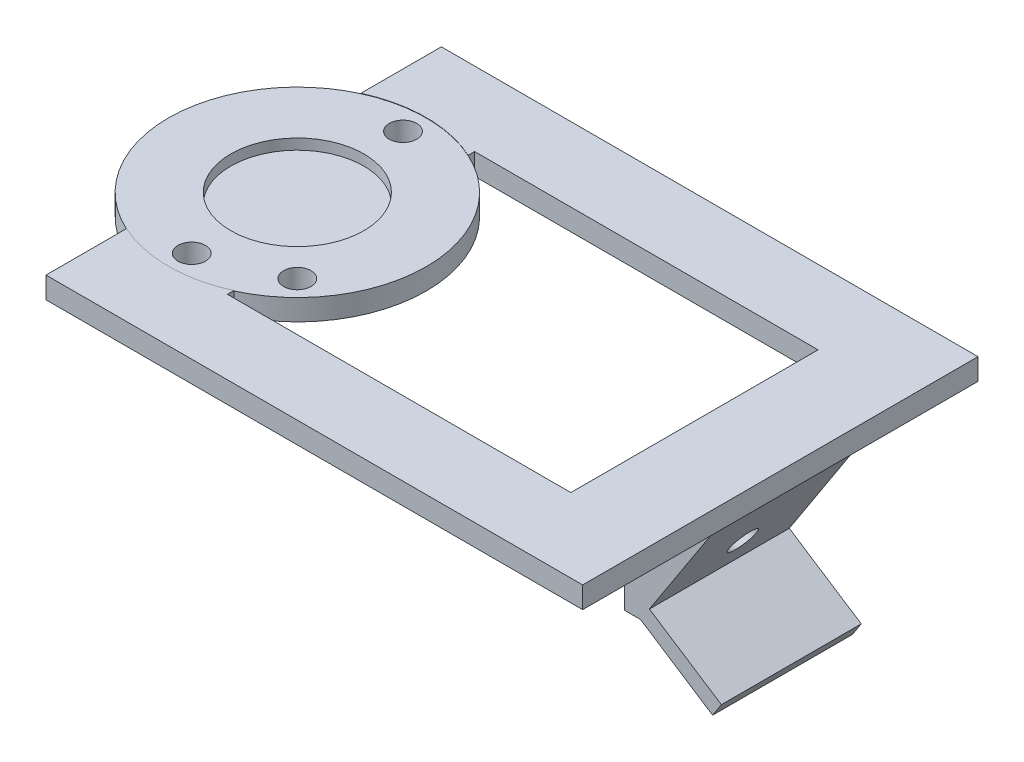
ISO-10303-21;
HEADER;
FILE_DESCRIPTION(('STEP AP214'),'2;1');
FILE_NAME('part.step','',(''),(''),'','','');
FILE_SCHEMA(('AUTOMOTIVE_DESIGN { 1 0 10303 214 1 1 1 1 }'));
ENDSEC;
DATA;
#1=APPLICATION_CONTEXT('core data for automotive mechanical design processes');
#2=APPLICATION_PROTOCOL_DEFINITION('international standard','automotive_design',2000,#1);
#3=PRODUCT_CONTEXT('',#1,'mechanical');
#4=PRODUCT('Part','Part','',(#3));
#5=PRODUCT_RELATED_PRODUCT_CATEGORY('part','',(#4));
#6=PRODUCT_DEFINITION_FORMATION('','',#4);
#7=PRODUCT_DEFINITION_CONTEXT('part definition',#1,'design');
#8=PRODUCT_DEFINITION('design','',#6,#7);
#9=PRODUCT_DEFINITION_SHAPE('','',#8);
#10=(LENGTH_UNIT() NAMED_UNIT(*) SI_UNIT(.MILLI.,.METRE.));
#11=(NAMED_UNIT(*) PLANE_ANGLE_UNIT() SI_UNIT($,.RADIAN.));
#12=(NAMED_UNIT(*) SI_UNIT($,.STERADIAN.) SOLID_ANGLE_UNIT());
#13=UNCERTAINTY_MEASURE_WITH_UNIT(LENGTH_MEASURE(1.E-05),#10,'distance_accuracy_value','');
#14=(GEOMETRIC_REPRESENTATION_CONTEXT(3) GLOBAL_UNCERTAINTY_ASSIGNED_CONTEXT((#13)) GLOBAL_UNIT_ASSIGNED_CONTEXT((#10,
#11,#12)) REPRESENTATION_CONTEXT('',''));
#15=CARTESIAN_POINT('',(0.,0.,0.));
#16=DIRECTION('',(0.,0.,1.));
#17=DIRECTION('',(1.,0.,0.));
#18=AXIS2_PLACEMENT_3D('',#15,#16,#17);
#19=CARTESIAN_POINT('',(99.0145469016071,-9.53413144874305,0.));
#20=DIRECTION('',(0.838443616300637,-0.544988350595414,0.));
#21=DIRECTION('',(0.544988350595414,0.838443616300637,0.));
#22=AXIS2_PLACEMENT_3D('',#19,#20,#21);
#23=CYLINDRICAL_SURFACE('',#22,3.302);
#24=CARTESIAN_POINT('',(105.403487257818,-13.6869426802801,0.));
#25=DIRECTION('',(0.838443616300637,-0.544988350595414,0.));
#26=DIRECTION('',(0.544988350595414,0.838443616300637,0.));
#27=AXIS2_PLACEMENT_3D('',#24,#25,#26);
#28=CIRCLE('',#27,3.302);
#29=CARTESIAN_POINT('',(107.203038791484,-10.9184018592554,0.));
#30=VERTEX_POINT('',#29);
#31=EDGE_CURVE('E684',#30,#30,#28,.T.);
#32=ORIENTED_EDGE('',*,*,#31,.T.);
#33=EDGE_LOOP('',(#32));
#34=FACE_BOUND('',#33,.T.);
#35=CARTESIAN_POINT('',(101.730392816078,-11.2994312931489,0.));
#36=DIRECTION('',(-0.813733471206735,0.581238193719096,0.));
#37=DIRECTION('',(0.581238193719096,0.813733471206735,0.));
#38=AXIS2_PLACEMENT_3D('',#35,#36,#37);
#39=ELLIPSE('',#38,3.30518064540003,3.302);
#40=CARTESIAN_POINT('',(103.651490044325,-8.60989517360224,0.));
#41=VERTEX_POINT('',#40);
#42=EDGE_CURVE('E39',#41,#41,#39,.F.);
#43=ORIENTED_EDGE('',*,*,#42,.F.);
#44=EDGE_LOOP('',(#43));
#45=FACE_BOUND('',#44,.T.);
#46=ADVANCED_FACE('F35',(#34,#45),#23,.F.);
#47=CARTESIAN_POINT('',(97.79,-25.4,-16.7198719801008));
#48=DIRECTION('',(-0.838443616300637,0.544988350595414,0.));
#49=DIRECTION('',(-0.544988350595414,-0.838443616300637,0.));
#50=AXIS2_PLACEMENT_3D('',#47,#48,#49);
#51=PLANE('',#50);
#52=ORIENTED_EDGE('',*,*,#31,.F.);
#53=EDGE_LOOP('',(#52));
#54=FACE_BOUND('',#53,.T.);
#55=DIRECTION('',(0.,0.,1.));
#56=VECTOR('',#55,1.);
#57=CARTESIAN_POINT('',(99.8664056157685,-22.2055298218946,-16.5541280198992));
#58=LINE('',#57,#56);
#59=CARTESIAN_POINT('',(99.8664056157685,-22.2055298218946,-16.5541280198992));
#60=VERTEX_POINT('',#59);
#61=CARTESIAN_POINT('',(99.8664056157685,-22.2055298218946,16.5541280198992));
#62=VERTEX_POINT('',#61);
#63=EDGE_CURVE('E204',#60,#62,#58,.T.);
#64=ORIENTED_EDGE('',*,*,#63,.F.);
#65=DIRECTION('',(-0.544988350595414,-0.838443616300637,0.));
#66=VECTOR('',#65,1.);
#67=CARTESIAN_POINT('',(96.6583831282953,-27.1409490333919,-16.5541280198992));
#68=LINE('',#67,#66);
#69=CARTESIAN_POINT('',(114.3,0.,-16.5541280198992));
#70=VERTEX_POINT('',#69);
#71=EDGE_CURVE('E210',#70,#60,#68,.T.);
#72=ORIENTED_EDGE('',*,*,#71,.F.);
#73=DIRECTION('',(0.,0.,1.));
#74=VECTOR('',#73,1.);
#75=CARTESIAN_POINT('',(114.3,0.,-16.7198719801008));
#76=LINE('',#75,#74);
#77=CARTESIAN_POINT('',(114.3,0.,16.5541280198992));
#78=VERTEX_POINT('',#77);
#79=EDGE_CURVE('E226',#70,#78,#76,.T.);
#80=ORIENTED_EDGE('',*,*,#79,.T.);
#81=DIRECTION('',(-0.544988350595414,-0.838443616300637,0.));
#82=VECTOR('',#81,1.);
#83=CARTESIAN_POINT('',(97.79,-25.4,16.5541280198992));
#84=LINE('',#83,#82);
#85=EDGE_CURVE('E223',#78,#62,#84,.T.);
#86=ORIENTED_EDGE('',*,*,#85,.T.);
#87=EDGE_LOOP('',(#64,#72,#80,#86));
#88=FACE_BOUND('',#87,.T.);
#89=ADVANCED_FACE('F469',(#54,#88),#51,.F.);
#90=CARTESIAN_POINT('',(93.98,0.,-34.2458719801008));
#91=DIRECTION('',(1.,0.,0.));
#92=DIRECTION('',(0.,0.,-1.));
#93=AXIS2_PLACEMENT_3D('',#90,#91,#92);
#94=PLANE('',#93);
#95=DIRECTION('',(0.,0.,1.));
#96=VECTOR('',#95,1.);
#97=CARTESIAN_POINT('',(93.98,0.,-34.2458719801008));
#98=LINE('',#97,#96);
#99=CARTESIAN_POINT('',(93.98,0.,-29.2541280198992));
#100=VERTEX_POINT('',#99);
#101=CARTESIAN_POINT('',(93.98,0.,29.2541280198992));
#102=VERTEX_POINT('',#101);
#103=EDGE_CURVE('E252',#100,#102,#98,.T.);
#104=ORIENTED_EDGE('',*,*,#103,.T.);
#105=DIRECTION('',(0.,1.,0.));
#106=VECTOR('',#105,1.);
#107=CARTESIAN_POINT('',(93.98,0.,29.2541280198992));
#108=LINE('',#107,#106);
#109=CARTESIAN_POINT('',(93.98,5.08,29.2541280198992));
#110=VERTEX_POINT('',#109);
#111=EDGE_CURVE('E247',#102,#110,#108,.T.);
#112=ORIENTED_EDGE('',*,*,#111,.T.);
#113=DIRECTION('',(0.,0.,1.));
#114=VECTOR('',#113,1.);
#115=CARTESIAN_POINT('',(93.98,5.08,-34.2458719801008));
#116=LINE('',#115,#114);
#117=CARTESIAN_POINT('',(93.98,5.08,-29.2541280198992));
#118=VERTEX_POINT('',#117);
#119=EDGE_CURVE('E250',#118,#110,#116,.T.);
#120=ORIENTED_EDGE('',*,*,#119,.F.);
#121=DIRECTION('',(0.,-1.,0.));
#122=VECTOR('',#121,1.);
#123=CARTESIAN_POINT('',(93.98,0.,-29.2541280198992));
#124=LINE('',#123,#122);
#125=EDGE_CURVE('E254',#118,#100,#124,.T.);
#126=ORIENTED_EDGE('',*,*,#125,.T.);
#127=EDGE_LOOP('',(#104,#112,#120,#126));
#128=FACE_BOUND('',#127,.T.);
#129=ADVANCED_FACE('F453',(#128),#94,.F.);
#130=CARTESIAN_POINT('',(0.,0.,0.));
#131=DIRECTION('',(0.,1.,0.));
#132=DIRECTION('',(0.,0.,1.));
#133=AXIS2_PLACEMENT_3D('',#130,#131,#132);
#134=PLANE('',#133);
#135=DIRECTION('',(1.,0.,0.));
#136=VECTOR('',#135,1.);
#137=CARTESIAN_POINT('',(93.98,0.,-16.5541280198992));
#138=LINE('',#137,#136);
#139=CARTESIAN_POINT('',(106.68,0.,-16.5541280198992));
#140=VERTEX_POINT('',#139);
#141=EDGE_CURVE('E229',#140,#70,#138,.T.);
#142=ORIENTED_EDGE('',*,*,#141,.F.);
#143=DIRECTION('',(0.,0.,1.));
#144=VECTOR('',#143,1.);
#145=CARTESIAN_POINT('',(106.68,0.,-16.7198719801008));
#146=LINE('',#145,#144);
#147=CARTESIAN_POINT('',(106.68,0.,16.5541280198992));
#148=VERTEX_POINT('',#147);
#149=EDGE_CURVE('E217',#140,#148,#146,.T.);
#150=ORIENTED_EDGE('',*,*,#149,.T.);
#151=DIRECTION('',(-1.,0.,0.));
#152=VECTOR('',#151,1.);
#153=CARTESIAN_POINT('',(93.98,0.,16.5541280198992));
#154=LINE('',#153,#152);
#155=EDGE_CURVE('E234',#78,#148,#154,.T.);
#156=ORIENTED_EDGE('',*,*,#155,.F.);
#157=DIRECTION('',(0.,0.,-1.));
#158=VECTOR('',#157,1.);
#159=CARTESIAN_POINT('',(114.3,0.,-46.7801280198992));
#160=LINE('',#159,#158);
#161=CARTESIAN_POINT('',(114.3,0.,46.7801280198992));
#162=VERTEX_POINT('',#161);
#163=EDGE_CURVE('E274',#162,#78,#160,.T.);
#164=ORIENTED_EDGE('',*,*,#163,.F.);
#165=DIRECTION('',(-1.,0.,0.));
#166=VECTOR('',#165,1.);
#167=CARTESIAN_POINT('',(0.,0.,46.7801280198992));
#168=LINE('',#167,#166);
#169=CARTESIAN_POINT('',(-12.7,0.,46.7801280198992));
#170=VERTEX_POINT('',#169);
#171=EDGE_CURVE('E319',#162,#170,#168,.T.);
#172=ORIENTED_EDGE('',*,*,#171,.T.);
#173=DIRECTION('',(0.,0.,1.));
#174=VECTOR('',#173,1.);
#175=CARTESIAN_POINT('',(-12.7,0.,0.));
#176=LINE('',#175,#174);
#177=CARTESIAN_POINT('',(-12.7,0.,27.7301280198992));
#178=VERTEX_POINT('',#177);
#179=EDGE_CURVE('E315',#178,#170,#176,.T.);
#180=ORIENTED_EDGE('',*,*,#179,.F.);
#181=CARTESIAN_POINT('',(0.,0.,0.));
#182=DIRECTION('',(0.,1.,0.));
#183=DIRECTION('',(0.,0.,1.));
#184=AXIS2_PLACEMENT_3D('',#181,#182,#183);
#185=CIRCLE('',#184,30.5);
#186=CARTESIAN_POINT('',(-12.7,0.,-27.7301280198992));
#187=VERTEX_POINT('',#186);
#188=EDGE_CURVE('E374',#187,#178,#185,.T.);
#189=ORIENTED_EDGE('',*,*,#188,.F.);
#190=DIRECTION('',(0.,0.,-1.));
#191=VECTOR('',#190,1.);
#192=CARTESIAN_POINT('',(-12.7,0.,0.));
#193=LINE('',#192,#191);
#194=CARTESIAN_POINT('',(-12.7,0.,-46.7801280198992));
#195=VERTEX_POINT('',#194);
#196=EDGE_CURVE('E298',#187,#195,#193,.T.);
#197=ORIENTED_EDGE('',*,*,#196,.T.);
#198=DIRECTION('',(1.,0.,0.));
#199=VECTOR('',#198,1.);
#200=CARTESIAN_POINT('',(0.,0.,-46.7801280198992));
#201=LINE('',#200,#199);
#202=CARTESIAN_POINT('',(114.3,0.,-46.7801280198992));
#203=VERTEX_POINT('',#202);
#204=EDGE_CURVE('E288',#195,#203,#201,.T.);
#205=ORIENTED_EDGE('',*,*,#204,.T.);
#206=EDGE_CURVE('E273',#70,#203,#160,.T.);
#207=ORIENTED_EDGE('',*,*,#206,.F.);
#208=EDGE_LOOP('',(#142,#150,#156,#164,#172,#180,#189,#197,#205,#207));
#209=FACE_BOUND('',#208,.T.);
#210=CARTESIAN_POINT('',(17.6744764826842,0.,17.680862));
#211=DIRECTION('',(0.,-1.,0.));
#212=DIRECTION('',(0.,0.,-1.));
#213=AXIS2_PLACEMENT_3D('',#210,#211,#212);
#214=CIRCLE('',#213,3.25);
#215=CARTESIAN_POINT('',(17.6744764826842,0.,14.430862));
#216=VERTEX_POINT('',#215);
#217=EDGE_CURVE('E346',#216,#216,#214,.T.);
#218=ORIENTED_EDGE('',*,*,#217,.F.);
#219=EDGE_LOOP('',(#218));
#220=FACE_BOUND('',#219,.T.);
#221=CARTESIAN_POINT('',(0.,0.,25.));
#222=DIRECTION('',(0.,-1.,0.));
#223=DIRECTION('',(0.,0.,-1.));
#224=AXIS2_PLACEMENT_3D('',#221,#222,#223);
#225=CIRCLE('',#224,3.25);
#226=CARTESIAN_POINT('',(0.,0.,21.75));
#227=VERTEX_POINT('',#226);
#228=EDGE_CURVE('E352',#227,#227,#225,.T.);
#229=ORIENTED_EDGE('',*,*,#228,.F.);
#230=EDGE_LOOP('',(#229));
#231=FACE_BOUND('',#230,.T.);
#232=CARTESIAN_POINT('',(0.,0.,-25.));
#233=DIRECTION('',(0.,-1.,0.));
#234=DIRECTION('',(0.,0.,-1.));
#235=AXIS2_PLACEMENT_3D('',#232,#233,#234);
#236=CIRCLE('',#235,3.25);
#237=CARTESIAN_POINT('',(0.,0.,-28.25));
#238=VERTEX_POINT('',#237);
#239=EDGE_CURVE('E358',#238,#238,#236,.T.);
#240=ORIENTED_EDGE('',*,*,#239,.F.);
#241=EDGE_LOOP('',(#240));
#242=FACE_BOUND('',#241,.T.);
#243=CARTESIAN_POINT('',(0.,0.,0.));
#244=DIRECTION('',(0.,-1.,0.));
#245=DIRECTION('',(0.,0.,-1.));
#246=AXIS2_PLACEMENT_3D('',#243,#244,#245);
#247=CIRCLE('',#246,15.75);
#248=CARTESIAN_POINT('',(0.,0.,-15.75));
#249=VERTEX_POINT('',#248);
#250=EDGE_CURVE('E44',#249,#249,#247,.T.);
#251=ORIENTED_EDGE('',*,*,#250,.F.);
#252=EDGE_LOOP('',(#251));
#253=FACE_BOUND('',#252,.T.);
#254=DIRECTION('',(-1.,0.,0.));
#255=VECTOR('',#254,1.);
#256=CARTESIAN_POINT('',(114.3,0.,29.2541280198992));
#257=LINE('',#256,#255);
#258=CARTESIAN_POINT('',(12.7,0.,29.2541280198992));
#259=VERTEX_POINT('',#258);
#260=EDGE_CURVE('E265',#102,#259,#257,.T.);
#261=ORIENTED_EDGE('',*,*,#260,.F.);
#262=ORIENTED_EDGE('',*,*,#103,.F.);
#263=DIRECTION('',(-1.,0.,0.));
#264=VECTOR('',#263,1.);
#265=CARTESIAN_POINT('',(114.3,0.,-29.2541280198992));
#266=LINE('',#265,#264);
#267=CARTESIAN_POINT('',(12.7,0.,-29.2541280198992));
#268=VERTEX_POINT('',#267);
#269=EDGE_CURVE('E277',#100,#268,#266,.T.);
#270=ORIENTED_EDGE('',*,*,#269,.T.);
#271=DIRECTION('',(0.,0.,-1.));
#272=VECTOR('',#271,1.);
#273=CARTESIAN_POINT('',(12.7,0.,0.));
#274=LINE('',#273,#272);
#275=CARTESIAN_POINT('',(12.7,0.,-27.7301280198992));
#276=VERTEX_POINT('',#275);
#277=EDGE_CURVE('E283',#276,#268,#274,.T.);
#278=ORIENTED_EDGE('',*,*,#277,.F.);
#279=CARTESIAN_POINT('',(12.7,0.,27.7301280198992));
#280=VERTEX_POINT('',#279);
#281=EDGE_CURVE('E380',#280,#276,#185,.T.);
#282=ORIENTED_EDGE('',*,*,#281,.F.);
#283=DIRECTION('',(0.,0.,1.));
#284=VECTOR('',#283,1.);
#285=CARTESIAN_POINT('',(12.7,0.,0.));
#286=LINE('',#285,#284);
#287=EDGE_CURVE('E330',#280,#259,#286,.T.);
#288=ORIENTED_EDGE('',*,*,#287,.T.);
#289=EDGE_LOOP('',(#261,#262,#270,#278,#282,#288));
#290=FACE_BOUND('',#289,.T.);
#291=ADVANCED_FACE('F399',(#209,#220,#231,#242,#253,#290),#134,.F.);
#292=CARTESIAN_POINT('',(114.3,0.,-29.2541280198992));
#293=DIRECTION('',(0.,0.,-1.));
#294=DIRECTION('',(-1.,0.,0.));
#295=AXIS2_PLACEMENT_3D('',#292,#293,#294);
#296=PLANE('',#295);
#297=ORIENTED_EDGE('',*,*,#125,.F.);
#298=DIRECTION('',(-1.,0.,0.));
#299=VECTOR('',#298,1.);
#300=CARTESIAN_POINT('',(114.3,5.08,-29.2541280198992));
#301=LINE('',#300,#299);
#302=CARTESIAN_POINT('',(12.7,5.08,-29.2541280198992));
#303=VERTEX_POINT('',#302);
#304=EDGE_CURVE('E281',#118,#303,#301,.T.);
#305=ORIENTED_EDGE('',*,*,#304,.T.);
#306=DIRECTION('',(0.,-1.,0.));
#307=VECTOR('',#306,1.);
#308=CARTESIAN_POINT('',(12.7,0.,-29.2541280198992));
#309=LINE('',#308,#307);
#310=EDGE_CURVE('E267',#303,#268,#309,.T.);
#311=ORIENTED_EDGE('',*,*,#310,.T.);
#312=ORIENTED_EDGE('',*,*,#269,.F.);
#313=EDGE_LOOP('',(#297,#305,#311,#312));
#314=FACE_BOUND('',#313,.T.);
#315=ADVANCED_FACE('F451',(#314),#296,.F.);
#316=CARTESIAN_POINT('',(114.3,0.,29.2541280198992));
#317=DIRECTION('',(0.,0.,1.));
#318=DIRECTION('',(1.,0.,0.));
#319=AXIS2_PLACEMENT_3D('',#316,#317,#318);
#320=PLANE('',#319);
#321=ORIENTED_EDGE('',*,*,#111,.F.);
#322=ORIENTED_EDGE('',*,*,#260,.T.);
#323=DIRECTION('',(0.,1.,0.));
#324=VECTOR('',#323,1.);
#325=CARTESIAN_POINT('',(12.7,0.,29.2541280198992));
#326=LINE('',#325,#324);
#327=CARTESIAN_POINT('',(12.7,5.08,29.2541280198992));
#328=VERTEX_POINT('',#327);
#329=EDGE_CURVE('E257',#259,#328,#326,.T.);
#330=ORIENTED_EDGE('',*,*,#329,.T.);
#331=DIRECTION('',(-1.,0.,0.));
#332=VECTOR('',#331,1.);
#333=CARTESIAN_POINT('',(114.3,5.08,29.2541280198992));
#334=LINE('',#333,#332);
#335=EDGE_CURVE('E261',#110,#328,#334,.T.);
#336=ORIENTED_EDGE('',*,*,#335,.F.);
#337=EDGE_LOOP('',(#321,#322,#330,#336));
#338=FACE_BOUND('',#337,.T.);
#339=ADVANCED_FACE('F457',(#338),#320,.F.);
#340=CARTESIAN_POINT('',(12.7,5.08,0.));
#341=DIRECTION('',(1.,0.,0.));
#342=DIRECTION('',(0.,0.,-1.));
#343=AXIS2_PLACEMENT_3D('',#340,#341,#342);
#344=PLANE('',#343);
#345=DIRECTION('',(0.,0.,1.));
#346=VECTOR('',#345,1.);
#347=CARTESIAN_POINT('',(12.7,5.08,0.));
#348=LINE('',#347,#346);
#349=CARTESIAN_POINT('',(12.7,5.08,27.7301280198992));
#350=VERTEX_POINT('',#349);
#351=EDGE_CURVE('E321',#350,#328,#348,.T.);
#352=ORIENTED_EDGE('',*,*,#351,.T.);
#353=ORIENTED_EDGE('',*,*,#329,.F.);
#354=ORIENTED_EDGE('',*,*,#287,.F.);
#355=DIRECTION('',(0.,-1.,0.));
#356=VECTOR('',#355,1.);
#357=CARTESIAN_POINT('',(12.7,5.08,27.7301280198992));
#358=LINE('',#357,#356);
#359=CARTESIAN_POINT('',(12.7,5.,27.7301280198992));
#360=VERTEX_POINT('',#359);
#361=EDGE_CURVE('E341',#360,#280,#358,.T.);
#362=ORIENTED_EDGE('',*,*,#361,.F.);
#363=EDGE_CURVE('E338',#350,#360,#358,.T.);
#364=ORIENTED_EDGE('',*,*,#363,.F.);
#365=EDGE_LOOP('',(#352,#353,#354,#362,#364));
#366=FACE_BOUND('',#365,.T.);
#367=ADVANCED_FACE('F427',(#366),#344,.T.);
#368=CARTESIAN_POINT('',(12.7,5.08,0.));
#369=DIRECTION('',(-1.,0.,0.));
#370=DIRECTION('',(0.,0.,1.));
#371=AXIS2_PLACEMENT_3D('',#368,#369,#370);
#372=PLANE('',#371);
#373=ORIENTED_EDGE('',*,*,#310,.F.);
#374=DIRECTION('',(0.,0.,-1.));
#375=VECTOR('',#374,1.);
#376=CARTESIAN_POINT('',(12.7,5.08,0.));
#377=LINE('',#376,#375);
#378=CARTESIAN_POINT('',(12.7,5.08,-27.7301280198992));
#379=VERTEX_POINT('',#378);
#380=EDGE_CURVE('E284',#379,#303,#377,.T.);
#381=ORIENTED_EDGE('',*,*,#380,.F.);
#382=DIRECTION('',(0.,-1.,0.));
#383=VECTOR('',#382,1.);
#384=CARTESIAN_POINT('',(12.7,5.08,-27.7301280198992));
#385=LINE('',#384,#383);
#386=CARTESIAN_POINT('',(12.7,5.,-27.7301280198992));
#387=VERTEX_POINT('',#386);
#388=EDGE_CURVE('E310',#379,#387,#385,.T.);
#389=ORIENTED_EDGE('',*,*,#388,.T.);
#390=EDGE_CURVE('E295',#387,#276,#385,.T.);
#391=ORIENTED_EDGE('',*,*,#390,.T.);
#392=ORIENTED_EDGE('',*,*,#277,.T.);
#393=EDGE_LOOP('',(#373,#381,#389,#391,#392));
#394=FACE_BOUND('',#393,.T.);
#395=ADVANCED_FACE('F435',(#394),#372,.F.);
#396=CARTESIAN_POINT('',(0.,5.,0.));
#397=DIRECTION('',(0.,-1.,0.));
#398=DIRECTION('',(0.,0.,-1.));
#399=AXIS2_PLACEMENT_3D('',#396,#397,#398);
#400=CYLINDRICAL_SURFACE('',#399,30.5);
#401=ORIENTED_EDGE('',*,*,#390,.F.);
#402=CARTESIAN_POINT('',(0.,5.,0.));
#403=DIRECTION('',(0.,1.,0.));
#404=DIRECTION('',(0.,0.,1.));
#405=AXIS2_PLACEMENT_3D('',#402,#403,#404);
#406=CIRCLE('',#405,30.5);
#407=EDGE_CURVE('E370',#360,#387,#406,.T.);
#408=ORIENTED_EDGE('',*,*,#407,.F.);
#409=ORIENTED_EDGE('',*,*,#361,.T.);
#410=ORIENTED_EDGE('',*,*,#281,.T.);
#411=EDGE_LOOP('',(#401,#408,#409,#410));
#412=FACE_BOUND('',#411,.T.);
#413=ADVANCED_FACE('F424',(#412),#400,.T.);
#414=CARTESIAN_POINT('',(-12.7,5.,-27.7301280198992));
#415=VERTEX_POINT('',#414);
#416=CARTESIAN_POINT('',(-12.7,5.,27.7301280198992));
#417=VERTEX_POINT('',#416);
#418=EDGE_CURVE('E379',#415,#417,#406,.T.);
#419=ORIENTED_EDGE('',*,*,#418,.F.);
#420=DIRECTION('',(0.,-1.,0.));
#421=VECTOR('',#420,1.);
#422=CARTESIAN_POINT('',(-12.7,5.08,-27.7301280198992));
#423=LINE('',#422,#421);
#424=EDGE_CURVE('E309',#415,#187,#423,.T.);
#425=ORIENTED_EDGE('',*,*,#424,.T.);
#426=ORIENTED_EDGE('',*,*,#188,.T.);
#427=DIRECTION('',(0.,-1.,0.));
#428=VECTOR('',#427,1.);
#429=CARTESIAN_POINT('',(-12.7,5.08,27.7301280198992));
#430=LINE('',#429,#428);
#431=EDGE_CURVE('E327',#417,#178,#430,.T.);
#432=ORIENTED_EDGE('',*,*,#431,.F.);
#433=EDGE_LOOP('',(#419,#425,#426,#432));
#434=FACE_BOUND('',#433,.T.);
#435=ADVANCED_FACE('F37',(#434),#400,.T.);
#436=CARTESIAN_POINT('',(0.,5.,0.));
#437=DIRECTION('',(0.,1.,0.));
#438=DIRECTION('',(0.,0.,1.));
#439=AXIS2_PLACEMENT_3D('',#436,#437,#438);
#440=PLANE('',#439);
#441=CARTESIAN_POINT('',(17.6744764826842,5.,17.680862));
#442=DIRECTION('',(0.,1.,0.));
#443=DIRECTION('',(0.,0.,1.));
#444=AXIS2_PLACEMENT_3D('',#441,#442,#443);
#445=CIRCLE('',#444,3.25);
#446=CARTESIAN_POINT('',(17.6744764826842,5.,20.930862));
#447=VERTEX_POINT('',#446);
#448=EDGE_CURVE('E349',#447,#447,#445,.T.);
#449=ORIENTED_EDGE('',*,*,#448,.F.);
#450=EDGE_LOOP('',(#449));
#451=FACE_BOUND('',#450,.T.);
#452=CARTESIAN_POINT('',(0.,5.,25.));
#453=DIRECTION('',(0.,1.,0.));
#454=DIRECTION('',(0.,0.,1.));
#455=AXIS2_PLACEMENT_3D('',#452,#453,#454);
#456=CIRCLE('',#455,3.25);
#457=CARTESIAN_POINT('',(0.,5.,28.25));
#458=VERTEX_POINT('',#457);
#459=EDGE_CURVE('E355',#458,#458,#456,.T.);
#460=ORIENTED_EDGE('',*,*,#459,.F.);
#461=EDGE_LOOP('',(#460));
#462=FACE_BOUND('',#461,.T.);
#463=CARTESIAN_POINT('',(0.,5.,-25.));
#464=DIRECTION('',(0.,1.,0.));
#465=DIRECTION('',(0.,0.,1.));
#466=AXIS2_PLACEMENT_3D('',#463,#464,#465);
#467=CIRCLE('',#466,3.25);
#468=CARTESIAN_POINT('',(0.,5.,-21.75));
#469=VERTEX_POINT('',#468);
#470=EDGE_CURVE('E361',#469,#469,#467,.T.);
#471=ORIENTED_EDGE('',*,*,#470,.F.);
#472=EDGE_LOOP('',(#471));
#473=FACE_BOUND('',#472,.T.);
#474=CARTESIAN_POINT('',(0.,5.,0.));
#475=DIRECTION('',(0.,1.,0.));
#476=DIRECTION('',(0.,0.,1.));
#477=AXIS2_PLACEMENT_3D('',#474,#475,#476);
#478=CIRCLE('',#477,15.75);
#479=CARTESIAN_POINT('',(0.,5.,15.75));
#480=VERTEX_POINT('',#479);
#481=EDGE_CURVE('E367',#480,#480,#478,.T.);
#482=ORIENTED_EDGE('',*,*,#481,.F.);
#483=EDGE_LOOP('',(#482));
#484=FACE_BOUND('',#483,.T.);
#485=ORIENTED_EDGE('',*,*,#407,.T.);
#486=CARTESIAN_POINT('',(0.,5.,0.));
#487=DIRECTION('',(0.,1.,0.));
#488=DIRECTION('',(0.,0.,1.));
#489=AXIS2_PLACEMENT_3D('',#486,#487,#488);
#490=CIRCLE('',#489,30.5);
#491=EDGE_CURVE('E305',#387,#415,#490,.T.);
#492=ORIENTED_EDGE('',*,*,#491,.T.);
#493=ORIENTED_EDGE('',*,*,#418,.T.);
#494=CARTESIAN_POINT('',(0.,5.,0.));
#495=DIRECTION('',(0.,1.,0.));
#496=DIRECTION('',(0.,0.,1.));
#497=AXIS2_PLACEMENT_3D('',#494,#495,#496);
#498=CIRCLE('',#497,30.5);
#499=EDGE_CURVE('E337',#417,#360,#498,.T.);
#500=ORIENTED_EDGE('',*,*,#499,.T.);
#501=EDGE_LOOP('',(#485,#492,#493,#500));
#502=FACE_BOUND('',#501,.T.);
#503=ADVANCED_FACE('F421',(#451,#462,#473,#484,#502),#440,.T.);
#504=CARTESIAN_POINT('',(0.,2.5,0.));
#505=DIRECTION('',(0.,1.,0.));
#506=DIRECTION('',(0.,0.,1.));
#507=AXIS2_PLACEMENT_3D('',#504,#505,#506);
#508=CYLINDRICAL_SURFACE('',#507,15.75);
#509=CARTESIAN_POINT('',(0.,2.5,0.));
#510=DIRECTION('',(0.,1.,0.));
#511=DIRECTION('',(0.,0.,1.));
#512=AXIS2_PLACEMENT_3D('',#509,#510,#511);
#513=CIRCLE('',#512,15.75);
#514=CARTESIAN_POINT('',(0.,2.5,15.75));
#515=VERTEX_POINT('',#514);
#516=EDGE_CURVE('E371',#515,#515,#513,.T.);
#517=ORIENTED_EDGE('',*,*,#516,.F.);
#518=EDGE_LOOP('',(#517));
#519=FACE_BOUND('',#518,.T.);
#520=ORIENTED_EDGE('',*,*,#481,.T.);
#521=EDGE_LOOP('',(#520));
#522=FACE_BOUND('',#521,.T.);
#523=ADVANCED_FACE('F519',(#519,#522),#508,.F.);
#524=CARTESIAN_POINT('',(0.,2.5,0.));
#525=DIRECTION('',(0.,1.,0.));
#526=DIRECTION('',(0.,0.,1.));
#527=AXIS2_PLACEMENT_3D('',#524,#525,#526);
#528=PLANE('',#527);
#529=ORIENTED_EDGE('',*,*,#516,.T.);
#530=EDGE_LOOP('',(#529));
#531=FACE_BOUND('',#530,.T.);
#532=ADVANCED_FACE('F523',(#531),#528,.T.);
#533=CARTESIAN_POINT('',(0.,-2.5,0.));
#534=DIRECTION('',(0.,1.,0.));
#535=DIRECTION('',(0.,0.,1.));
#536=AXIS2_PLACEMENT_3D('',#533,#534,#535);
#537=CYLINDRICAL_SURFACE('',#536,15.75);
#538=CARTESIAN_POINT('',(0.,-2.5,0.));
#539=DIRECTION('',(0.,-1.,0.));
#540=DIRECTION('',(0.,0.,-1.));
#541=AXIS2_PLACEMENT_3D('',#538,#539,#540);
#542=CIRCLE('',#541,15.75);
#543=CARTESIAN_POINT('',(0.,-2.5,-15.75));
#544=VERTEX_POINT('',#543);
#545=EDGE_CURVE('E364',#544,#544,#542,.T.);
#546=ORIENTED_EDGE('',*,*,#545,.F.);
#547=EDGE_LOOP('',(#546));
#548=FACE_BOUND('',#547,.T.);
#549=ORIENTED_EDGE('',*,*,#250,.T.);
#550=EDGE_LOOP('',(#549));
#551=FACE_BOUND('',#550,.T.);
#552=ADVANCED_FACE('F527',(#548,#551),#537,.T.);
#553=CARTESIAN_POINT('',(0.,-2.5,0.));
#554=DIRECTION('',(0.,-1.,0.));
#555=DIRECTION('',(0.,0.,-1.));
#556=AXIS2_PLACEMENT_3D('',#553,#554,#555);
#557=PLANE('',#556);
#558=ORIENTED_EDGE('',*,*,#545,.T.);
#559=EDGE_LOOP('',(#558));
#560=FACE_BOUND('',#559,.T.);
#561=ADVANCED_FACE('F531',(#560),#557,.T.);
#562=CARTESIAN_POINT('',(0.,5.08,-25.));
#563=DIRECTION('',(0.,-1.,0.));
#564=DIRECTION('',(0.,0.,-1.));
#565=AXIS2_PLACEMENT_3D('',#562,#563,#564);
#566=CYLINDRICAL_SURFACE('',#565,3.25);
#567=ORIENTED_EDGE('',*,*,#470,.T.);
#568=EDGE_LOOP('',(#567));
#569=FACE_BOUND('',#568,.T.);
#570=ORIENTED_EDGE('',*,*,#239,.T.);
#571=EDGE_LOOP('',(#570));
#572=FACE_BOUND('',#571,.T.);
#573=ADVANCED_FACE('F535',(#569,#572),#566,.F.);
#574=CARTESIAN_POINT('',(0.,5.08,25.));
#575=DIRECTION('',(0.,-1.,0.));
#576=DIRECTION('',(0.,0.,-1.));
#577=AXIS2_PLACEMENT_3D('',#574,#575,#576);
#578=CYLINDRICAL_SURFACE('',#577,3.25);
#579=ORIENTED_EDGE('',*,*,#459,.T.);
#580=EDGE_LOOP('',(#579));
#581=FACE_BOUND('',#580,.T.);
#582=ORIENTED_EDGE('',*,*,#228,.T.);
#583=EDGE_LOOP('',(#582));
#584=FACE_BOUND('',#583,.T.);
#585=ADVANCED_FACE('F539',(#581,#584),#578,.F.);
#586=CARTESIAN_POINT('',(17.6744764826842,5.08,17.680862));
#587=DIRECTION('',(0.,-1.,0.));
#588=DIRECTION('',(0.,0.,-1.));
#589=AXIS2_PLACEMENT_3D('',#586,#587,#588);
#590=CYLINDRICAL_SURFACE('',#589,3.25);
#591=ORIENTED_EDGE('',*,*,#448,.T.);
#592=EDGE_LOOP('',(#591));
#593=FACE_BOUND('',#592,.T.);
#594=ORIENTED_EDGE('',*,*,#217,.T.);
#595=EDGE_LOOP('',(#594));
#596=FACE_BOUND('',#595,.T.);
#597=ADVANCED_FACE('F543',(#593,#596),#590,.F.);
#598=CARTESIAN_POINT('',(-12.7,5.08,0.));
#599=DIRECTION('',(1.,0.,0.));
#600=DIRECTION('',(0.,0.,-1.));
#601=AXIS2_PLACEMENT_3D('',#598,#599,#600);
#602=PLANE('',#601);
#603=ORIENTED_EDGE('',*,*,#179,.T.);
#604=DIRECTION('',(0.,-1.,0.));
#605=VECTOR('',#604,1.);
#606=CARTESIAN_POINT('',(-12.7,5.08,46.7801280198992));
#607=LINE('',#606,#605);
#608=CARTESIAN_POINT('',(-12.7,5.08,46.7801280198992));
#609=VERTEX_POINT('',#608);
#610=EDGE_CURVE('E335',#609,#170,#607,.T.);
#611=ORIENTED_EDGE('',*,*,#610,.F.);
#612=DIRECTION('',(0.,0.,1.));
#613=VECTOR('',#612,1.);
#614=CARTESIAN_POINT('',(-12.7,5.08,0.));
#615=LINE('',#614,#613);
#616=CARTESIAN_POINT('',(-12.7,5.08,27.7301280198992));
#617=VERTEX_POINT('',#616);
#618=EDGE_CURVE('E316',#617,#609,#615,.T.);
#619=ORIENTED_EDGE('',*,*,#618,.F.);
#620=EDGE_CURVE('E342',#617,#417,#430,.T.);
#621=ORIENTED_EDGE('',*,*,#620,.T.);
#622=ORIENTED_EDGE('',*,*,#431,.T.);
#623=EDGE_LOOP('',(#603,#611,#619,#621,#622));
#624=FACE_BOUND('',#623,.T.);
#625=ADVANCED_FACE('F394',(#624),#602,.F.);
#626=CARTESIAN_POINT('',(0.,5.08,46.7801280198992));
#627=DIRECTION('',(0.,0.,1.));
#628=DIRECTION('',(1.,0.,0.));
#629=AXIS2_PLACEMENT_3D('',#626,#627,#628);
#630=PLANE('',#629);
#631=ORIENTED_EDGE('',*,*,#171,.F.);
#632=DIRECTION('',(0.,-1.,0.));
#633=VECTOR('',#632,1.);
#634=CARTESIAN_POINT('',(114.3,0.,46.7801280198992));
#635=LINE('',#634,#633);
#636=CARTESIAN_POINT('',(114.3,5.08,46.7801280198992));
#637=VERTEX_POINT('',#636);
#638=EDGE_CURVE('E258',#637,#162,#635,.T.);
#639=ORIENTED_EDGE('',*,*,#638,.F.);
#640=DIRECTION('',(-1.,0.,0.));
#641=VECTOR('',#640,1.);
#642=CARTESIAN_POINT('',(0.,5.08,46.7801280198992));
#643=LINE('',#642,#641);
#644=EDGE_CURVE('E324',#637,#609,#643,.T.);
#645=ORIENTED_EDGE('',*,*,#644,.T.);
#646=ORIENTED_EDGE('',*,*,#610,.T.);
#647=EDGE_LOOP('',(#631,#639,#645,#646));
#648=FACE_BOUND('',#647,.T.);
#649=ADVANCED_FACE('F405',(#648),#630,.T.);
#650=CARTESIAN_POINT('',(0.,5.08,0.));
#651=DIRECTION('',(0.,-1.,0.));
#652=DIRECTION('',(0.,0.,-1.));
#653=AXIS2_PLACEMENT_3D('',#650,#651,#652);
#654=CYLINDRICAL_SURFACE('',#653,30.5);
#655=ORIENTED_EDGE('',*,*,#499,.F.);
#656=ORIENTED_EDGE('',*,*,#620,.F.);
#657=CARTESIAN_POINT('',(0.,5.08,0.));
#658=DIRECTION('',(0.,-1.,0.));
#659=DIRECTION('',(0.,0.,-1.));
#660=AXIS2_PLACEMENT_3D('',#657,#658,#659);
#661=CIRCLE('',#660,30.5);
#662=EDGE_CURVE('E318',#350,#617,#661,.T.);
#663=ORIENTED_EDGE('',*,*,#662,.F.);
#664=ORIENTED_EDGE('',*,*,#363,.T.);
#665=EDGE_LOOP('',(#655,#656,#663,#664));
#666=FACE_BOUND('',#665,.T.);
#667=ADVANCED_FACE('F418',(#666),#654,.F.);
#668=CARTESIAN_POINT('',(0.,5.08,0.));
#669=DIRECTION('',(0.,-1.,0.));
#670=DIRECTION('',(0.,0.,-1.));
#671=AXIS2_PLACEMENT_3D('',#668,#669,#670);
#672=PLANE('',#671);
#673=ORIENTED_EDGE('',*,*,#304,.F.);
#674=ORIENTED_EDGE('',*,*,#119,.T.);
#675=ORIENTED_EDGE('',*,*,#335,.T.);
#676=ORIENTED_EDGE('',*,*,#351,.F.);
#677=ORIENTED_EDGE('',*,*,#662,.T.);
#678=ORIENTED_EDGE('',*,*,#618,.T.);
#679=ORIENTED_EDGE('',*,*,#644,.F.);
#680=DIRECTION('',(0.,0.,1.));
#681=VECTOR('',#680,1.);
#682=CARTESIAN_POINT('',(114.3,5.08,-46.7801280198992));
#683=LINE('',#682,#681);
#684=CARTESIAN_POINT('',(114.3,5.08,-46.7801280198992));
#685=VERTEX_POINT('',#684);
#686=EDGE_CURVE('E271',#685,#637,#683,.T.);
#687=ORIENTED_EDGE('',*,*,#686,.F.);
#688=DIRECTION('',(1.,0.,0.));
#689=VECTOR('',#688,1.);
#690=CARTESIAN_POINT('',(0.,5.08,-46.7801280198992));
#691=LINE('',#690,#689);
#692=CARTESIAN_POINT('',(-12.7,5.08,-46.7801280198992));
#693=VERTEX_POINT('',#692);
#694=EDGE_CURVE('E293',#693,#685,#691,.T.);
#695=ORIENTED_EDGE('',*,*,#694,.F.);
#696=DIRECTION('',(0.,0.,-1.));
#697=VECTOR('',#696,1.);
#698=CARTESIAN_POINT('',(-12.7,5.08,0.));
#699=LINE('',#698,#697);
#700=CARTESIAN_POINT('',(-12.7,5.08,-27.7301280198992));
#701=VERTEX_POINT('',#700);
#702=EDGE_CURVE('E290',#701,#693,#699,.T.);
#703=ORIENTED_EDGE('',*,*,#702,.F.);
#704=CARTESIAN_POINT('',(0.,5.08,0.));
#705=DIRECTION('',(0.,-1.,0.));
#706=DIRECTION('',(0.,0.,-1.));
#707=AXIS2_PLACEMENT_3D('',#704,#705,#706);
#708=CIRCLE('',#707,30.5);
#709=EDGE_CURVE('E287',#701,#379,#708,.T.);
#710=ORIENTED_EDGE('',*,*,#709,.T.);
#711=ORIENTED_EDGE('',*,*,#380,.T.);
#712=EDGE_LOOP('',(#673,#674,#675,#676,#677,#678,#679,#687,#695,#703,#710,#711));
#713=FACE_BOUND('',#712,.T.);
#714=ADVANCED_FACE('F414',(#713),#672,.F.);
#715=CARTESIAN_POINT('',(0.,5.08,-46.7801280198992));
#716=DIRECTION('',(0.,0.,-1.));
#717=DIRECTION('',(-1.,0.,0.));
#718=AXIS2_PLACEMENT_3D('',#715,#716,#717);
#719=PLANE('',#718);
#720=ORIENTED_EDGE('',*,*,#204,.F.);
#721=DIRECTION('',(0.,-1.,0.));
#722=VECTOR('',#721,1.);
#723=CARTESIAN_POINT('',(-12.7,5.08,-46.7801280198992));
#724=LINE('',#723,#722);
#725=EDGE_CURVE('E303',#693,#195,#724,.T.);
#726=ORIENTED_EDGE('',*,*,#725,.F.);
#727=ORIENTED_EDGE('',*,*,#694,.T.);
#728=DIRECTION('',(0.,1.,0.));
#729=VECTOR('',#728,1.);
#730=CARTESIAN_POINT('',(114.3,0.,-46.7801280198992));
#731=LINE('',#730,#729);
#732=EDGE_CURVE('E268',#203,#685,#731,.T.);
#733=ORIENTED_EDGE('',*,*,#732,.F.);
#734=EDGE_LOOP('',(#720,#726,#727,#733));
#735=FACE_BOUND('',#734,.T.);
#736=ADVANCED_FACE('F447',(#735),#719,.T.);
#737=CARTESIAN_POINT('',(-12.7,5.08,0.));
#738=DIRECTION('',(-1.,0.,0.));
#739=DIRECTION('',(0.,0.,1.));
#740=AXIS2_PLACEMENT_3D('',#737,#738,#739);
#741=PLANE('',#740);
#742=ORIENTED_EDGE('',*,*,#196,.F.);
#743=ORIENTED_EDGE('',*,*,#424,.F.);
#744=EDGE_CURVE('E306',#701,#415,#423,.T.);
#745=ORIENTED_EDGE('',*,*,#744,.F.);
#746=ORIENTED_EDGE('',*,*,#702,.T.);
#747=ORIENTED_EDGE('',*,*,#725,.T.);
#748=EDGE_LOOP('',(#742,#743,#745,#746,#747));
#749=FACE_BOUND('',#748,.T.);
#750=ADVANCED_FACE('F443',(#749),#741,.T.);
#751=CARTESIAN_POINT('',(0.,5.08,0.));
#752=DIRECTION('',(0.,-1.,0.));
#753=DIRECTION('',(0.,0.,-1.));
#754=AXIS2_PLACEMENT_3D('',#751,#752,#753);
#755=CYLINDRICAL_SURFACE('',#754,30.5);
#756=ORIENTED_EDGE('',*,*,#491,.F.);
#757=ORIENTED_EDGE('',*,*,#388,.F.);
#758=ORIENTED_EDGE('',*,*,#709,.F.);
#759=ORIENTED_EDGE('',*,*,#744,.T.);
#760=EDGE_LOOP('',(#756,#757,#758,#759));
#761=FACE_BOUND('',#760,.T.);
#762=ADVANCED_FACE('F440',(#761),#755,.F.);
#763=CARTESIAN_POINT('',(114.3,0.,0.));
#764=DIRECTION('',(1.,0.,0.));
#765=DIRECTION('',(0.,0.,-1.));
#766=AXIS2_PLACEMENT_3D('',#763,#764,#765);
#767=PLANE('',#766);
#768=ORIENTED_EDGE('',*,*,#79,.F.);
#769=ORIENTED_EDGE('',*,*,#206,.T.);
#770=ORIENTED_EDGE('',*,*,#732,.T.);
#771=ORIENTED_EDGE('',*,*,#686,.T.);
#772=ORIENTED_EDGE('',*,*,#638,.T.);
#773=ORIENTED_EDGE('',*,*,#163,.T.);
#774=EDGE_LOOP('',(#768,#769,#770,#771,#772,#773));
#775=FACE_BOUND('',#774,.T.);
#776=ADVANCED_FACE('F408',(#775),#767,.T.);
#777=DIRECTION('',(0.,1.,0.));
#778=VECTOR('',#777,1.);
#779=CARTESIAN_POINT('',(93.98,-25.4,16.5541280198992));
#780=LINE('',#779,#778);
#781=CARTESIAN_POINT('',(93.98,-25.4,16.5541280198992));
#782=VERTEX_POINT('',#781);
#783=CARTESIAN_POINT('',(93.98,-17.78,16.5541280198992));
#784=VERTEX_POINT('',#783);
#785=EDGE_CURVE('E239',#782,#784,#780,.T.);
#786=ORIENTED_EDGE('',*,*,#785,.T.);
#787=DIRECTION('',(0.,0.,1.));
#788=VECTOR('',#787,1.);
#789=CARTESIAN_POINT('',(93.98,-17.78,-16.7198719801008));
#790=LINE('',#789,#788);
#791=CARTESIAN_POINT('',(93.98,-17.78,-16.5541280198992));
#792=VERTEX_POINT('',#791);
#793=EDGE_CURVE('E51',#792,#784,#790,.T.);
#794=ORIENTED_EDGE('',*,*,#793,.F.);
#795=DIRECTION('',(0.,1.,0.));
#796=VECTOR('',#795,1.);
#797=CARTESIAN_POINT('',(93.98,-25.4,-16.5541280198992));
#798=LINE('',#797,#796);
#799=CARTESIAN_POINT('',(93.98,-25.4,-16.5541280198992));
#800=VERTEX_POINT('',#799);
#801=EDGE_CURVE('E245',#800,#792,#798,.T.);
#802=ORIENTED_EDGE('',*,*,#801,.F.);
#803=DIRECTION('',(0.,0.,-1.));
#804=VECTOR('',#803,1.);
#805=CARTESIAN_POINT('',(93.98,-25.4,-16.5541280198992));
#806=LINE('',#805,#804);
#807=EDGE_CURVE('E230',#782,#800,#806,.T.);
#808=ORIENTED_EDGE('',*,*,#807,.F.);
#809=EDGE_LOOP('',(#786,#794,#802,#808));
#810=FACE_BOUND('',#809,.T.);
#811=ADVANCED_FACE('F504',(#810),#94,.F.);
#812=CARTESIAN_POINT('',(93.98,-25.4,-16.5541280198992));
#813=DIRECTION('',(0.,0.,1.));
#814=DIRECTION('',(1.,0.,0.));
#815=AXIS2_PLACEMENT_3D('',#812,#813,#814);
#816=PLANE('',#815);
#817=ORIENTED_EDGE('',*,*,#801,.T.);
#818=DIRECTION('',(0.581238193719096,0.813733471206736,0.));
#819=VECTOR('',#818,1.);
#820=CARTESIAN_POINT('',(90.3759459459459,-22.8256756756757,-16.5541280198992));
#821=LINE('',#820,#819);
#822=EDGE_CURVE('E219',#792,#140,#821,.T.);
#823=ORIENTED_EDGE('',*,*,#822,.T.);
#824=ORIENTED_EDGE('',*,*,#141,.T.);
#825=ORIENTED_EDGE('',*,*,#71,.T.);
#826=DIRECTION('',(-0.838443616300637,0.544988350595414,0.));
#827=VECTOR('',#826,1.);
#828=CARTESIAN_POINT('',(116.903579898997,-33.2796931059934,-16.5541280198992));
#829=LINE('',#828,#827);
#830=CARTESIAN_POINT('',(116.903579898997,-33.2796931059934,-16.5541280198992));
#831=VERTEX_POINT('',#830);
#832=EDGE_CURVE('E189',#831,#60,#829,.T.);
#833=ORIENTED_EDGE('',*,*,#832,.F.);
#834=DIRECTION('',(0.544988350595413,0.838443616300638,0.));
#835=VECTOR('',#834,1.);
#836=CARTESIAN_POINT('',(114.827174283229,-36.4741632840988,-16.5541280198992));
#837=LINE('',#836,#835);
#838=CARTESIAN_POINT('',(114.827174283229,-36.4741632840988,-16.5541280198992));
#839=VERTEX_POINT('',#838);
#840=EDGE_CURVE('E196',#839,#831,#837,.T.);
#841=ORIENTED_EDGE('',*,*,#840,.F.);
#842=DIRECTION('',(-0.838443616300637,0.544988350595414,0.));
#843=VECTOR('',#842,1.);
#844=CARTESIAN_POINT('',(114.827174283229,-36.4741632840988,-16.5541280198992));
#845=LINE('',#844,#843);
#846=CARTESIAN_POINT('',(97.79,-25.4,-16.5541280198992));
#847=VERTEX_POINT('',#846);
#848=EDGE_CURVE('E688',#839,#847,#845,.T.);
#849=ORIENTED_EDGE('',*,*,#848,.T.);
#850=DIRECTION('',(1.,0.,0.));
#851=VECTOR('',#850,1.);
#852=CARTESIAN_POINT('',(93.98,-25.4,-16.5541280198992));
#853=LINE('',#852,#851);
#854=EDGE_CURVE('E233',#800,#847,#853,.T.);
#855=ORIENTED_EDGE('',*,*,#854,.F.);
#856=EDGE_LOOP('',(#817,#823,#824,#825,#833,#841,#849,#855));
#857=FACE_BOUND('',#856,.T.);
#858=ADVANCED_FACE('F208',(#857),#816,.F.);
#859=CARTESIAN_POINT('',(93.98,-25.4,16.5541280198992));
#860=DIRECTION('',(0.,0.,-1.));
#861=DIRECTION('',(-1.,0.,0.));
#862=AXIS2_PLACEMENT_3D('',#859,#860,#861);
#863=PLANE('',#862);
#864=ORIENTED_EDGE('',*,*,#155,.T.);
#865=DIRECTION('',(0.581238193719096,0.813733471206736,0.));
#866=VECTOR('',#865,1.);
#867=CARTESIAN_POINT('',(93.98,-17.78,16.5541280198992));
#868=LINE('',#867,#866);
#869=EDGE_CURVE('E211',#784,#148,#868,.T.);
#870=ORIENTED_EDGE('',*,*,#869,.F.);
#871=ORIENTED_EDGE('',*,*,#785,.F.);
#872=DIRECTION('',(-1.,0.,0.));
#873=VECTOR('',#872,1.);
#874=CARTESIAN_POINT('',(93.98,-25.4,16.5541280198992));
#875=LINE('',#874,#873);
#876=CARTESIAN_POINT('',(97.79,-25.4,16.5541280198992));
#877=VERTEX_POINT('',#876);
#878=EDGE_CURVE('E237',#877,#782,#875,.T.);
#879=ORIENTED_EDGE('',*,*,#878,.F.);
#880=DIRECTION('',(-0.838443616300637,0.544988350595414,0.));
#881=VECTOR('',#880,1.);
#882=CARTESIAN_POINT('',(114.827174283229,-36.4741632840988,16.5541280198992));
#883=LINE('',#882,#881);
#884=CARTESIAN_POINT('',(114.827174283229,-36.4741632840988,16.5541280198992));
#885=VERTEX_POINT('',#884);
#886=EDGE_CURVE('E59',#885,#877,#883,.T.);
#887=ORIENTED_EDGE('',*,*,#886,.F.);
#888=DIRECTION('',(-0.544988350595412,-0.838443616300638,0.));
#889=VECTOR('',#888,1.);
#890=CARTESIAN_POINT('',(114.827174283229,-36.4741632840988,16.5541280198992));
#891=LINE('',#890,#889);
#892=CARTESIAN_POINT('',(116.903579898997,-33.2796931059934,16.5541280198992));
#893=VERTEX_POINT('',#892);
#894=EDGE_CURVE('E195',#893,#885,#891,.T.);
#895=ORIENTED_EDGE('',*,*,#894,.F.);
#896=DIRECTION('',(-0.838443616300637,0.544988350595414,0.));
#897=VECTOR('',#896,1.);
#898=CARTESIAN_POINT('',(116.903579898997,-33.2796931059934,16.5541280198992));
#899=LINE('',#898,#897);
#900=EDGE_CURVE('E192',#893,#62,#899,.T.);
#901=ORIENTED_EDGE('',*,*,#900,.T.);
#902=ORIENTED_EDGE('',*,*,#85,.F.);
#903=EDGE_LOOP('',(#864,#870,#871,#879,#887,#895,#901,#902));
#904=FACE_BOUND('',#903,.T.);
#905=ADVANCED_FACE('F498',(#904),#863,.F.);
#906=CARTESIAN_POINT('',(0.,-25.4,0.));
#907=DIRECTION('',(0.,1.,0.));
#908=DIRECTION('',(0.,0.,1.));
#909=AXIS2_PLACEMENT_3D('',#906,#907,#908);
#910=PLANE('',#909);
#911=ORIENTED_EDGE('',*,*,#854,.T.);
#912=DIRECTION('',(0.,0.,1.));
#913=VECTOR('',#912,1.);
#914=CARTESIAN_POINT('',(97.79,-25.4,0.));
#915=LINE('',#914,#913);
#916=EDGE_CURVE('E11',#847,#877,#915,.T.);
#917=ORIENTED_EDGE('',*,*,#916,.T.);
#918=ORIENTED_EDGE('',*,*,#878,.T.);
#919=ORIENTED_EDGE('',*,*,#807,.T.);
#920=EDGE_LOOP('',(#911,#917,#918,#919));
#921=FACE_BOUND('',#920,.T.);
#922=ADVANCED_FACE('F493',(#921),#910,.F.);
#923=CARTESIAN_POINT('',(93.98,-17.78,-16.7198719801008));
#924=DIRECTION('',(0.813733471206736,-0.581238193719096,0.));
#925=DIRECTION('',(0.581238193719096,0.813733471206736,0.));
#926=AXIS2_PLACEMENT_3D('',#923,#924,#925);
#927=PLANE('',#926);
#928=CARTESIAN_POINT('',(99.5986946523423,-9.91382748672087,0.));
#929=DIRECTION('',(-0.813733471206735,0.581238193719096,0.));
#930=DIRECTION('',(-0.581238193719096,-0.813733471206735,0.));
#931=AXIS2_PLACEMENT_3D('',#928,#929,#930);
#932=CIRCLE('',#931,4.826);
#933=CARTESIAN_POINT('',(96.7936391294539,-13.8409052187646,0.));
#934=VERTEX_POINT('',#933);
#935=EDGE_CURVE('E680',#934,#934,#932,.T.);
#936=ORIENTED_EDGE('',*,*,#935,.F.);
#937=EDGE_LOOP('',(#936));
#938=FACE_BOUND('',#937,.T.);
#939=ORIENTED_EDGE('',*,*,#793,.T.);
#940=ORIENTED_EDGE('',*,*,#869,.T.);
#941=ORIENTED_EDGE('',*,*,#149,.F.);
#942=ORIENTED_EDGE('',*,*,#822,.F.);
#943=EDGE_LOOP('',(#939,#940,#941,#942));
#944=FACE_BOUND('',#943,.T.);
#945=ADVANCED_FACE('F491',(#938,#944),#927,.F.);
#946=CARTESIAN_POINT('',(116.903579898997,-33.2796931059934,-16.5541280198992));
#947=DIRECTION('',(-0.544988350595414,-0.838443616300637,0.));
#948=DIRECTION('',(0.838443616300637,-0.544988350595414,0.));
#949=AXIS2_PLACEMENT_3D('',#946,#947,#948);
#950=PLANE('',#949);
#951=ORIENTED_EDGE('',*,*,#63,.T.);
#952=ORIENTED_EDGE('',*,*,#900,.F.);
#953=DIRECTION('',(0.,0.,1.));
#954=VECTOR('',#953,1.);
#955=CARTESIAN_POINT('',(116.903579898997,-33.2796931059934,-16.5541280198992));
#956=LINE('',#955,#954);
#957=EDGE_CURVE('E185',#831,#893,#956,.T.);
#958=ORIENTED_EDGE('',*,*,#957,.F.);
#959=ORIENTED_EDGE('',*,*,#832,.T.);
#960=EDGE_LOOP('',(#951,#952,#958,#959));
#961=FACE_BOUND('',#960,.T.);
#962=ADVANCED_FACE('F187',(#961),#950,.F.);
#963=CARTESIAN_POINT('',(114.827174283229,-36.4741632840988,-16.5541280198992));
#964=DIRECTION('',(0.544988350595414,0.838443616300637,0.));
#965=DIRECTION('',(-0.838443616300637,0.544988350595414,0.));
#966=AXIS2_PLACEMENT_3D('',#963,#964,#965);
#967=PLANE('',#966);
#968=ORIENTED_EDGE('',*,*,#916,.F.);
#969=ORIENTED_EDGE('',*,*,#848,.F.);
#970=DIRECTION('',(0.,0.,-1.));
#971=VECTOR('',#970,1.);
#972=CARTESIAN_POINT('',(114.827174283229,-36.4741632840988,-16.5541280198992));
#973=LINE('',#972,#971);
#974=EDGE_CURVE('E200',#885,#839,#973,.T.);
#975=ORIENTED_EDGE('',*,*,#974,.F.);
#976=ORIENTED_EDGE('',*,*,#886,.T.);
#977=EDGE_LOOP('',(#968,#969,#975,#976));
#978=FACE_BOUND('',#977,.T.);
#979=ADVANCED_FACE('F486',(#978),#967,.F.);
#980=CARTESIAN_POINT('',(97.3886681320867,-63.3026342858562,0.));
#981=DIRECTION('',(0.838443616300638,-0.544988350595413,0.));
#982=DIRECTION('',(0.544988350595413,0.838443616300638,0.));
#983=AXIS2_PLACEMENT_3D('',#980,#981,#982);
#984=PLANE('',#983);
#985=ORIENTED_EDGE('',*,*,#840,.T.);
#986=ORIENTED_EDGE('',*,*,#957,.T.);
#987=ORIENTED_EDGE('',*,*,#894,.T.);
#988=ORIENTED_EDGE('',*,*,#974,.T.);
#989=EDGE_LOOP('',(#985,#986,#987,#988));
#990=FACE_BOUND('',#989,.T.);
#991=ADVANCED_FACE('F199',(#990),#984,.T.);
#992=CARTESIAN_POINT('',(101.665577669207,-11.3901724987674,0.));
#993=DIRECTION('',(-0.813733471206735,0.581238193719096,0.));
#994=DIRECTION('',(-0.581238193719096,-0.813733471206735,0.));
#995=AXIS2_PLACEMENT_3D('',#992,#993,#994);
#996=PLANE('',#995);
#997=CARTESIAN_POINT('',(101.665577669207,-11.3901724987674,0.));
#998=DIRECTION('',(-0.813733471206735,0.581238193719096,0.));
#999=DIRECTION('',(-0.581238193719096,-0.813733471206735,0.));
#1000=AXIS2_PLACEMENT_3D('',#997,#998,#999);
#1001=CIRCLE('',#1000,4.826);
#1002=CARTESIAN_POINT('',(98.860522146319,-15.3172502308111,0.));
#1003=VERTEX_POINT('',#1002);
#1004=EDGE_CURVE('E677',#1003,#1003,#1001,.T.);
#1005=ORIENTED_EDGE('',*,*,#1004,.T.);
#1006=EDGE_LOOP('',(#1005));
#1007=FACE_BOUND('',#1006,.T.);
#1008=ORIENTED_EDGE('',*,*,#42,.T.);
#1009=EDGE_LOOP('',(#1008));
#1010=FACE_BOUND('',#1009,.T.);
#1011=ADVANCED_FACE('F485',(#1007,#1010),#996,.T.);
#1012=CARTESIAN_POINT('',(101.665577669207,-11.3901724987674,0.));
#1013=DIRECTION('',(-0.813733471206735,0.581238193719096,0.));
#1014=DIRECTION('',(-0.581238193719096,-0.813733471206736,0.));
#1015=AXIS2_PLACEMENT_3D('',#1012,#1013,#1014);
#1016=CYLINDRICAL_SURFACE('',#1015,4.826);
#1017=CARTESIAN_POINT('',(98.860522146319,-15.3172502308111,0.));
#1018=CARTESIAN_POINT('',(98.8389921148934,-15.3018716369356,0.));
#1019=CARTESIAN_POINT('',(98.8174620834677,-15.2864930430601,0.));
#1020=CARTESIAN_POINT('',(98.7744020206163,-15.2557358553091,0.));
#1021=CARTESIAN_POINT('',(98.7528719891906,-15.2403572614337,0.));
#1022=CARTESIAN_POINT('',(98.7098119263393,-15.2096000736827,0.));
#1023=CARTESIAN_POINT('',(98.6882818949136,-15.1942214798072,0.));
#1024=CARTESIAN_POINT('',(98.6452218320623,-15.1634642920562,0.));
#1025=CARTESIAN_POINT('',(98.6236918006366,-15.1480856981808,0.));
#1026=CARTESIAN_POINT('',(98.5806317377852,-15.1173285104298,0.));
#1027=CARTESIAN_POINT('',(98.5591017063595,-15.1019499165543,0.));
#1028=CARTESIAN_POINT('',(98.5160416435082,-15.0711927288033,0.));
#1029=CARTESIAN_POINT('',(98.4945116120825,-15.0558141349278,0.));
#1030=CARTESIAN_POINT('',(98.4514515492312,-15.0250569471769,0.));
#1031=CARTESIAN_POINT('',(98.4299215178055,-15.0096783533014,0.));
#1032=CARTESIAN_POINT('',(98.3868614549541,-14.9789211655504,0.));
#1033=CARTESIAN_POINT('',(98.3653314235284,-14.9635425716749,0.));
#1034=CARTESIAN_POINT('',(98.3222713606771,-14.932785383924,0.));
#1035=CARTESIAN_POINT('',(98.3007413292514,-14.9174067900485,0.));
#1036=CARTESIAN_POINT('',(98.2576812664001,-14.8866496022975,0.));
#1037=CARTESIAN_POINT('',(98.2361512349744,-14.871271008422,0.));
#1038=CARTESIAN_POINT('',(98.193091172123,-14.8405138206711,0.));
#1039=CARTESIAN_POINT('',(98.1715611406973,-14.8251352267956,0.));
#1040=CARTESIAN_POINT('',(98.128501077846,-14.7943780390446,0.));
#1041=CARTESIAN_POINT('',(98.1069710464203,-14.7789994451691,0.));
#1042=CARTESIAN_POINT('',(98.063910983569,-14.7482422574182,0.));
#1043=CARTESIAN_POINT('',(98.0423809521433,-14.7328636635427,0.));
#1044=CARTESIAN_POINT('',(97.9993208892919,-14.7021064757917,0.));
#1045=CARTESIAN_POINT('',(97.9777908578662,-14.6867278819162,0.));
#1046=CARTESIAN_POINT('',(97.9347307950149,-14.6559706941653,0.));
#1047=CARTESIAN_POINT('',(97.9132007635892,-14.6405921002898,0.));
#1048=CARTESIAN_POINT('',(97.8701407007378,-14.6098349125388,0.));
#1049=CARTESIAN_POINT('',(97.8486106693122,-14.5944563186633,0.));
#1050=CARTESIAN_POINT('',(97.8055506064608,-14.5636991309123,0.));
#1051=CARTESIAN_POINT('',(97.7840205750351,-14.5483205370369,0.));
#1052=CARTESIAN_POINT('',(97.7409605121838,-14.5175633492859,0.));
#1053=CARTESIAN_POINT('',(97.7194304807581,-14.5021847554104,0.));
#1054=CARTESIAN_POINT('',(97.6763704179067,-14.4714275676594,0.));
#1055=CARTESIAN_POINT('',(97.6548403864811,-14.456048973784,0.));
#1056=CARTESIAN_POINT('',(97.6117803236297,-14.425291786033,0.));
#1057=CARTESIAN_POINT('',(97.590250292204,-14.4099131921575,0.));
#1058=CARTESIAN_POINT('',(97.5471902293527,-14.3791560044065,0.));
#1059=CARTESIAN_POINT('',(97.525660197927,-14.363777410531,0.));
#1060=CARTESIAN_POINT('',(97.4826001350756,-14.3330202227801,0.));
#1061=CARTESIAN_POINT('',(97.4610701036499,-14.3176416289046,0.));
#1062=CARTESIAN_POINT('',(97.4180100407986,-14.2868844411536,0.));
#1063=CARTESIAN_POINT('',(97.3964800093729,-14.2715058472781,0.));
#1064=CARTESIAN_POINT('',(97.3534199465216,-14.2407486595272,0.));
#1065=CARTESIAN_POINT('',(97.3318899150959,-14.2253700656517,0.));
#1066=CARTESIAN_POINT('',(97.2888298522445,-14.1946128779007,0.));
#1067=CARTESIAN_POINT('',(97.2672998208188,-14.1792342840252,0.));
#1068=CARTESIAN_POINT('',(97.2242397579675,-14.1484770962743,0.));
#1069=CARTESIAN_POINT('',(97.2027097265418,-14.1330985023988,0.));
#1070=CARTESIAN_POINT('',(97.1596496636905,-14.1023413146478,0.));
#1071=CARTESIAN_POINT('',(97.1381196322648,-14.0869627207723,0.));
#1072=CARTESIAN_POINT('',(97.0950595694134,-14.0562055330214,0.));
#1073=CARTESIAN_POINT('',(97.0735295379877,-14.0408269391459,0.));
#1074=CARTESIAN_POINT('',(97.0304694751364,-14.0100697513949,0.));
#1075=CARTESIAN_POINT('',(97.0089394437107,-13.9946911575194,0.));
#1076=CARTESIAN_POINT('',(96.9658793808594,-13.9639339697685,0.));
#1077=CARTESIAN_POINT('',(96.9443493494337,-13.948555375893,0.));
#1078=CARTESIAN_POINT('',(96.9012892865823,-13.917798188142,0.));
#1079=CARTESIAN_POINT('',(96.8797592551566,-13.9024195942665,0.));
#1080=CARTESIAN_POINT('',(96.8366991923053,-13.8716624065155,0.));
#1081=CARTESIAN_POINT('',(96.8151691608796,-13.8562838126401,0.));
#1082=CARTESIAN_POINT('',(96.7936391294539,-13.8409052187646,0.));
#1083=B_SPLINE_CURVE_WITH_KNOTS('',3,(#1017,#1018,#1019,#1020,#1021,#1022,#1023,#1024,#1025,
#1026,#1027,#1028,#1029,#1030,#1031,#1032,#1033,#1034,#1035,#1036,#1037,#1038,#1039,#1040,#1041,
#1042,#1043,#1044,#1045,#1046,#1047,#1048,#1049,#1050,#1051,#1052,#1053,#1054,#1055,#1056,#1057,
#1058,#1059,#1060,#1061,#1062,#1063,#1064,#1065,#1066,#1067,#1068,#1069,#1070,#1071,#1072,#1073,
#1074,#1075,#1076,#1077,#1078,#1079,#1080,#1081,#1082),.UNSPECIFIED.,.F.,.F.,(4,2,2,2,2,2,2,2,2,
2,2,2,2,2,2,2,2,2,2,2,2,2,2,2,2,2,2,2,2,2,2,2,4),(0.,0.0793749999999997,0.158749999999999,
0.238124999999999,0.317499999999998,0.396874999999998,0.476249999999997,0.555624999999997,
0.634999999999996,0.714374999999995,0.793749999999995,0.873124999999995,0.952499999999993,
1.03187499999999,1.11124999999999,1.19062499999999,1.27,1.349375,1.42875,1.508125,1.5875,
1.666875,1.74625,1.825625,1.905,1.984375,2.06375,2.143125,2.2225,2.301875,2.38125,
2.46062499999999,2.54000000000001),.UNSPECIFIED.);
#1084=EDGE_CURVE('BSEAM481',#1003,#934,#1083,.T.);
#1085=ORIENTED_EDGE('',*,*,#1004,.F.);
#1086=ORIENTED_EDGE('',*,*,#935,.T.);
#1087=ORIENTED_EDGE('',*,*,#1084,.T.);
#1088=ORIENTED_EDGE('',*,*,#1084,.F.);
#1089=EDGE_LOOP('',(#1085,#1087,#1086,#1088));
#1090=FACE_BOUND('',#1089,.T.);
#1091=ADVANCED_FACE('F481',(#1090),#1016,.F.);
#1092=CLOSED_SHELL('',(#46,#89,#129,#291,#315,#339,#367,#395,#413,#435,#503,#523,#532,#552,#561,
#573,#585,#597,#625,#649,#667,#714,#736,#750,#762,#776,#811,#858,#905,#922,#945,#962,#979,#991,
#1011,#1091));
#1093=MANIFOLD_SOLID_BREP('B2',#1092);
#1094=ADVANCED_BREP_SHAPE_REPRESENTATION('',(#18,#1093),#14);
#1095=SHAPE_DEFINITION_REPRESENTATION(#9,#1094);
ENDSEC;
END-ISO-10303-21;
